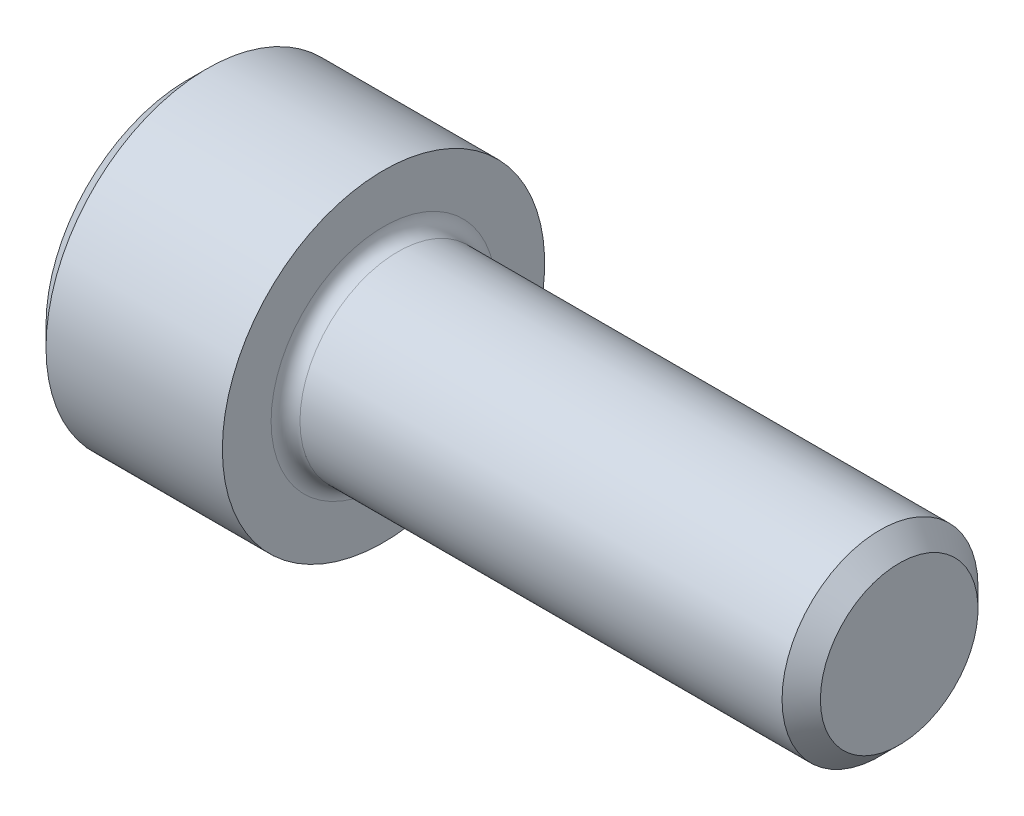
ISO-10303-21;
HEADER;
FILE_DESCRIPTION(('STEP AP214'),'2;1');
FILE_NAME('part.step','',(''),(''),'','','');
FILE_SCHEMA(('AUTOMOTIVE_DESIGN { 1 0 10303 214 1 1 1 1 }'));
ENDSEC;
DATA;
#1=APPLICATION_CONTEXT('core data for automotive mechanical design processes');
#2=APPLICATION_PROTOCOL_DEFINITION('international standard','automotive_design',2000,#1);
#3=PRODUCT_CONTEXT('',#1,'mechanical');
#4=PRODUCT('Part','Part','',(#3));
#5=PRODUCT_RELATED_PRODUCT_CATEGORY('part','',(#4));
#6=PRODUCT_DEFINITION_FORMATION('','',#4);
#7=PRODUCT_DEFINITION_CONTEXT('part definition',#1,'design');
#8=PRODUCT_DEFINITION('design','',#6,#7);
#9=PRODUCT_DEFINITION_SHAPE('','',#8);
#10=(LENGTH_UNIT() NAMED_UNIT(*) SI_UNIT(.MILLI.,.METRE.));
#11=(NAMED_UNIT(*) PLANE_ANGLE_UNIT() SI_UNIT($,.RADIAN.));
#12=(NAMED_UNIT(*) SI_UNIT($,.STERADIAN.) SOLID_ANGLE_UNIT());
#13=UNCERTAINTY_MEASURE_WITH_UNIT(LENGTH_MEASURE(1.E-05),#10,'distance_accuracy_value','');
#14=(GEOMETRIC_REPRESENTATION_CONTEXT(3) GLOBAL_UNCERTAINTY_ASSIGNED_CONTEXT((#13)) GLOBAL_UNIT_ASSIGNED_CONTEXT((#10,
#11,#12)) REPRESENTATION_CONTEXT('',''));
#15=CARTESIAN_POINT('',(0.,0.,0.));
#16=DIRECTION('',(0.,0.,1.));
#17=DIRECTION('',(1.,0.,0.));
#18=AXIS2_PLACEMENT_3D('',#15,#16,#17);
#19=CARTESIAN_POINT('',(0.,0.,0.));
#20=DIRECTION('',(-1.,0.,0.));
#21=DIRECTION('',(0.,0.,1.));
#22=AXIS2_PLACEMENT_3D('',#19,#20,#21);
#23=PLANE('',#22);
#24=DIRECTION('',(0.,-0.499999999999999,0.866025403784439));
#25=VECTOR('',#24,1.);
#26=CARTESIAN_POINT('',(0.,2.2920921156882,0.));
#27=LINE('',#26,#25);
#28=CARTESIAN_POINT('',(0.,2.2920921156882,0.));
#29=VERTEX_POINT('',#28);
#30=CARTESIAN_POINT('',(0.,1.14604605784411,1.98501));
#31=VERTEX_POINT('',#30);
#32=EDGE_CURVE('E388',#29,#31,#27,.T.);
#33=ORIENTED_EDGE('',*,*,#32,.T.);
#34=DIRECTION('',(0.,1.,0.));
#35=VECTOR('',#34,1.);
#36=CARTESIAN_POINT('',(0.,-1.14604605784409,1.98501));
#37=LINE('',#36,#35);
#38=CARTESIAN_POINT('',(0.,-1.14604605784409,1.98501));
#39=VERTEX_POINT('',#38);
#40=EDGE_CURVE('E130',#39,#31,#37,.T.);
#41=ORIENTED_EDGE('',*,*,#40,.F.);
#42=DIRECTION('',(0.,-0.500000000000001,-0.866025403784438));
#43=VECTOR('',#42,1.);
#44=CARTESIAN_POINT('',(0.,-1.14604605784409,1.98501));
#45=LINE('',#44,#43);
#46=CARTESIAN_POINT('',(0.,-2.29209211568819,0.));
#47=VERTEX_POINT('',#46);
#48=EDGE_CURVE('E391',#39,#47,#45,.T.);
#49=ORIENTED_EDGE('',*,*,#48,.T.);
#50=DIRECTION('',(0.,0.499999999999999,-0.866025403784439));
#51=VECTOR('',#50,1.);
#52=CARTESIAN_POINT('',(0.,-2.29209211568819,0.));
#53=LINE('',#52,#51);
#54=CARTESIAN_POINT('',(0.,-1.1460460578441,-1.98501));
#55=VERTEX_POINT('',#54);
#56=EDGE_CURVE('E394',#47,#55,#53,.T.);
#57=ORIENTED_EDGE('',*,*,#56,.T.);
#58=DIRECTION('',(0.,-1.,0.));
#59=VECTOR('',#58,1.);
#60=CARTESIAN_POINT('',(0.,1.1460460578441,-1.98501));
#61=LINE('',#60,#59);
#62=CARTESIAN_POINT('',(0.,1.1460460578441,-1.98501));
#63=VERTEX_POINT('',#62);
#64=EDGE_CURVE('E397',#63,#55,#61,.T.);
#65=ORIENTED_EDGE('',*,*,#64,.F.);
#66=DIRECTION('',(0.,-0.500000000000001,-0.866025403784438));
#67=VECTOR('',#66,1.);
#68=CARTESIAN_POINT('',(0.,2.2920921156882,0.));
#69=LINE('',#68,#67);
#70=EDGE_CURVE('E125',#29,#63,#69,.T.);
#71=ORIENTED_EDGE('',*,*,#70,.F.);
#72=EDGE_LOOP('',(#33,#41,#49,#57,#65,#71));
#73=FACE_BOUND('',#72,.T.);
#74=CARTESIAN_POINT('',(0.,0.,0.));
#75=DIRECTION('',(-1.,0.,0.));
#76=DIRECTION('',(0.,0.,1.));
#77=AXIS2_PLACEMENT_3D('',#74,#75,#76);
#78=CIRCLE('',#77,3.48615);
#79=CARTESIAN_POINT('',(0.,0.,3.48615));
#80=VERTEX_POINT('',#79);
#81=EDGE_CURVE('E141',#80,#80,#78,.T.);
#82=ORIENTED_EDGE('',*,*,#81,.T.);
#83=EDGE_LOOP('',(#82));
#84=FACE_BOUND('',#83,.T.);
#85=ADVANCED_FACE('F34',(#73,#84),#23,.T.);
#86=CARTESIAN_POINT('',(17.526,1.94056,0.));
#87=DIRECTION('',(1.,0.,0.));
#88=DIRECTION('',(0.,0.,-1.));
#89=AXIS2_PLACEMENT_3D('',#86,#87,#88);
#90=PLANE('',#89);
#91=CARTESIAN_POINT('',(17.526,0.,0.));
#92=DIRECTION('',(-1.,0.,0.));
#93=DIRECTION('',(0.,0.,1.));
#94=AXIS2_PLACEMENT_3D('',#91,#92,#93);
#95=CIRCLE('',#94,1.94056);
#96=CARTESIAN_POINT('',(17.526,0.,1.94056));
#97=VERTEX_POINT('',#96);
#98=EDGE_CURVE('E154',#97,#97,#95,.T.);
#99=ORIENTED_EDGE('',*,*,#98,.F.);
#100=EDGE_LOOP('',(#99));
#101=FACE_BOUND('',#100,.T.);
#102=ADVANCED_FACE('F175',(#101),#90,.T.);
#103=CARTESIAN_POINT('',(17.526,0.,0.));
#104=DIRECTION('',(-1.,0.,0.));
#105=DIRECTION('',(0.,0.,1.));
#106=AXIS2_PLACEMENT_3D('',#103,#104,#105);
#107=CONICAL_SURFACE('',#106,1.94056,0.785398163397459);
#108=CARTESIAN_POINT('',(17.05356,0.,0.));
#109=DIRECTION('',(-1.,0.,0.));
#110=DIRECTION('',(0.,0.,1.));
#111=AXIS2_PLACEMENT_3D('',#108,#109,#110);
#112=CIRCLE('',#111,2.413);
#113=CARTESIAN_POINT('',(17.05356,0.,2.413));
#114=VERTEX_POINT('',#113);
#115=EDGE_CURVE('E151',#114,#114,#112,.T.);
#116=ORIENTED_EDGE('',*,*,#115,.F.);
#117=EDGE_LOOP('',(#116));
#118=FACE_BOUND('',#117,.T.);
#119=ORIENTED_EDGE('',*,*,#98,.T.);
#120=EDGE_LOOP('',(#119));
#121=FACE_BOUND('',#120,.T.);
#122=ADVANCED_FACE('F181',(#118,#121),#107,.T.);
#123=CARTESIAN_POINT('',(-31.75,0.,0.));
#124=DIRECTION('',(-1.,0.,0.));
#125=DIRECTION('',(0.,0.,1.));
#126=AXIS2_PLACEMENT_3D('',#123,#124,#125);
#127=CYLINDRICAL_SURFACE('',#126,2.413);
#128=CARTESIAN_POINT('',(5.1816,0.,0.));
#129=DIRECTION('',(1.,0.,0.));
#130=DIRECTION('',(0.,0.,-1.));
#131=AXIS2_PLACEMENT_3D('',#128,#129,#130);
#132=CIRCLE('',#131,2.413);
#133=CARTESIAN_POINT('',(5.1816,0.,-2.413));
#134=VERTEX_POINT('',#133);
#135=EDGE_CURVE('E11',#134,#134,#132,.T.);
#136=ORIENTED_EDGE('',*,*,#135,.T.);
#137=EDGE_LOOP('',(#136));
#138=FACE_BOUND('',#137,.T.);
#139=ORIENTED_EDGE('',*,*,#115,.T.);
#140=EDGE_LOOP('',(#139));
#141=FACE_BOUND('',#140,.T.);
#142=ADVANCED_FACE('F192',(#138,#141),#127,.T.);
#143=CARTESIAN_POINT('',(4.826,3.96875,0.));
#144=DIRECTION('',(1.,0.,0.));
#145=DIRECTION('',(0.,0.,-1.));
#146=AXIS2_PLACEMENT_3D('',#143,#144,#145);
#147=PLANE('',#146);
#148=CARTESIAN_POINT('',(4.826,0.,0.));
#149=DIRECTION('',(1.,0.,0.));
#150=DIRECTION('',(0.,0.,-1.));
#151=AXIS2_PLACEMENT_3D('',#148,#149,#150);
#152=CIRCLE('',#151,2.7686);
#153=CARTESIAN_POINT('',(4.826,0.,-2.7686));
#154=VERTEX_POINT('',#153);
#155=EDGE_CURVE('E42',#154,#154,#152,.F.);
#156=ORIENTED_EDGE('',*,*,#155,.T.);
#157=EDGE_LOOP('',(#156));
#158=FACE_BOUND('',#157,.T.);
#159=CARTESIAN_POINT('',(4.826,0.,0.));
#160=DIRECTION('',(-1.,0.,0.));
#161=DIRECTION('',(0.,0.,1.));
#162=AXIS2_PLACEMENT_3D('',#159,#160,#161);
#163=CIRCLE('',#162,3.96875);
#164=CARTESIAN_POINT('',(4.826,0.,3.96875));
#165=VERTEX_POINT('',#164);
#166=EDGE_CURVE('E148',#165,#165,#163,.T.);
#167=ORIENTED_EDGE('',*,*,#166,.F.);
#168=EDGE_LOOP('',(#167));
#169=FACE_BOUND('',#168,.T.);
#170=ADVANCED_FACE('F159',(#158,#169),#147,.T.);
#171=CARTESIAN_POINT('',(-31.75,0.,0.));
#172=DIRECTION('',(-1.,0.,0.));
#173=DIRECTION('',(0.,0.,1.));
#174=AXIS2_PLACEMENT_3D('',#171,#172,#173);
#175=CYLINDRICAL_SURFACE('',#174,3.96875);
#176=ORIENTED_EDGE('',*,*,#166,.T.);
#177=EDGE_LOOP('',(#176));
#178=FACE_BOUND('',#177,.T.);
#179=CARTESIAN_POINT('',(0.4826,0.,0.));
#180=DIRECTION('',(-1.,0.,0.));
#181=DIRECTION('',(0.,0.,1.));
#182=AXIS2_PLACEMENT_3D('',#179,#180,#181);
#183=CIRCLE('',#182,3.96875);
#184=CARTESIAN_POINT('',(0.4826,0.,3.96875));
#185=VERTEX_POINT('',#184);
#186=EDGE_CURVE('E145',#185,#185,#183,.T.);
#187=ORIENTED_EDGE('',*,*,#186,.F.);
#188=EDGE_LOOP('',(#187));
#189=FACE_BOUND('',#188,.T.);
#190=ADVANCED_FACE('F170',(#178,#189),#175,.T.);
#191=CARTESIAN_POINT('',(0.,0.,0.));
#192=DIRECTION('',(1.,0.,0.));
#193=DIRECTION('',(0.,0.,-1.));
#194=AXIS2_PLACEMENT_3D('',#191,#192,#193);
#195=CONICAL_SURFACE('',#194,3.48615,0.785398163397453);
#196=ORIENTED_EDGE('',*,*,#186,.T.);
#197=EDGE_LOOP('',(#196));
#198=FACE_BOUND('',#197,.T.);
#199=ORIENTED_EDGE('',*,*,#81,.F.);
#200=EDGE_LOOP('',(#199));
#201=FACE_BOUND('',#200,.T.);
#202=ADVANCED_FACE('F163',(#198,#201),#195,.T.);
#203=CARTESIAN_POINT('',(5.1816,0.,0.));
#204=DIRECTION('',(1.,0.,0.));
#205=DIRECTION('',(0.,0.,-1.));
#206=AXIS2_PLACEMENT_3D('',#203,#204,#205);
#207=TOROIDAL_SURFACE('',#206,2.7686,0.3556);
#208=ORIENTED_EDGE('',*,*,#135,.F.);
#209=EDGE_LOOP('',(#208));
#210=FACE_BOUND('',#209,.T.);
#211=ORIENTED_EDGE('',*,*,#155,.F.);
#212=EDGE_LOOP('',(#211));
#213=FACE_BOUND('',#212,.T.);
#214=ADVANCED_FACE('F36',(#210,#213),#207,.F.);
#215=CARTESIAN_POINT('',(2.286,2.2920921156882,0.));
#216=DIRECTION('',(0.,-0.866025403784439,-0.499999999999999));
#217=DIRECTION('',(0.,0.499999999999999,-0.866025403784439));
#218=AXIS2_PLACEMENT_3D('',#215,#216,#217);
#219=PLANE('',#218);
#220=ORIENTED_EDGE('',*,*,#32,.F.);
#221=DIRECTION('',(-1.,0.,0.));
#222=VECTOR('',#221,1.);
#223=CARTESIAN_POINT('',(2.286,2.2920921156882,0.));
#224=LINE('',#223,#222);
#225=CARTESIAN_POINT('',(2.286,2.2920921156882,0.));
#226=VERTEX_POINT('',#225);
#227=EDGE_CURVE('E378',#226,#29,#224,.T.);
#228=ORIENTED_EDGE('',*,*,#227,.F.);
#229=DIRECTION('',(0.,-0.499999999999999,0.866025403784439));
#230=VECTOR('',#229,1.);
#231=CARTESIAN_POINT('',(2.286,2.2920921156882,0.));
#232=LINE('',#231,#230);
#233=CARTESIAN_POINT('',(2.286,1.71906908676615,0.992505));
#234=VERTEX_POINT('',#233);
#235=EDGE_CURVE('E117',#226,#234,#232,.T.);
#236=ORIENTED_EDGE('',*,*,#235,.T.);
#237=CARTESIAN_POINT('',(2.286,1.14604605784411,1.98501));
#238=VERTEX_POINT('',#237);
#239=EDGE_CURVE('E108',#234,#238,#232,.T.);
#240=ORIENTED_EDGE('',*,*,#239,.T.);
#241=DIRECTION('',(-1.,0.,0.));
#242=VECTOR('',#241,1.);
#243=CARTESIAN_POINT('',(2.286,1.14604605784411,1.98501));
#244=LINE('',#243,#242);
#245=EDGE_CURVE('E122',#238,#31,#244,.T.);
#246=ORIENTED_EDGE('',*,*,#245,.T.);
#247=EDGE_LOOP('',(#220,#228,#236,#240,#246));
#248=FACE_BOUND('',#247,.T.);
#249=ADVANCED_FACE('F121',(#248),#219,.T.);
#250=CARTESIAN_POINT('',(2.286,-1.14604605784409,1.98501));
#251=DIRECTION('',(0.,0.,1.));
#252=DIRECTION('',(0.,-1.,0.));
#253=AXIS2_PLACEMENT_3D('',#250,#251,#252);
#254=PLANE('',#253);
#255=ORIENTED_EDGE('',*,*,#40,.T.);
#256=ORIENTED_EDGE('',*,*,#245,.F.);
#257=DIRECTION('',(0.,1.,0.));
#258=VECTOR('',#257,1.);
#259=CARTESIAN_POINT('',(2.286,-1.14604605784409,1.98501));
#260=LINE('',#259,#258);
#261=CARTESIAN_POINT('',(2.286,0.,1.98501));
#262=VERTEX_POINT('',#261);
#263=EDGE_CURVE('E105',#262,#238,#260,.T.);
#264=ORIENTED_EDGE('',*,*,#263,.F.);
#265=CARTESIAN_POINT('',(2.286,-1.14604605784409,1.98501));
#266=VERTEX_POINT('',#265);
#267=EDGE_CURVE('E116',#266,#262,#260,.T.);
#268=ORIENTED_EDGE('',*,*,#267,.F.);
#269=DIRECTION('',(-1.,0.,0.));
#270=VECTOR('',#269,1.);
#271=CARTESIAN_POINT('',(2.286,-1.14604605784409,1.98501));
#272=LINE('',#271,#270);
#273=EDGE_CURVE('E132',#266,#39,#272,.T.);
#274=ORIENTED_EDGE('',*,*,#273,.T.);
#275=EDGE_LOOP('',(#255,#256,#264,#268,#274));
#276=FACE_BOUND('',#275,.T.);
#277=ADVANCED_FACE('F127',(#276),#254,.F.);
#278=CARTESIAN_POINT('',(2.286,-1.14604605784409,1.98501));
#279=DIRECTION('',(0.,0.866025403784438,-0.500000000000001));
#280=DIRECTION('',(0.,0.500000000000001,0.866025403784438));
#281=AXIS2_PLACEMENT_3D('',#278,#279,#280);
#282=PLANE('',#281);
#283=ORIENTED_EDGE('',*,*,#48,.F.);
#284=ORIENTED_EDGE('',*,*,#273,.F.);
#285=DIRECTION('',(0.,-0.500000000000001,-0.866025403784438));
#286=VECTOR('',#285,1.);
#287=CARTESIAN_POINT('',(2.286,-1.14604605784409,1.98501));
#288=LINE('',#287,#286);
#289=CARTESIAN_POINT('',(2.286,-1.71906908676614,0.992505));
#290=VERTEX_POINT('',#289);
#291=EDGE_CURVE('E417',#266,#290,#288,.T.);
#292=ORIENTED_EDGE('',*,*,#291,.T.);
#293=CARTESIAN_POINT('',(2.286,-2.29209211568819,0.));
#294=VERTEX_POINT('',#293);
#295=EDGE_CURVE('E406',#290,#294,#288,.T.);
#296=ORIENTED_EDGE('',*,*,#295,.T.);
#297=DIRECTION('',(-1.,0.,0.));
#298=VECTOR('',#297,1.);
#299=CARTESIAN_POINT('',(2.286,-2.29209211568819,0.));
#300=LINE('',#299,#298);
#301=EDGE_CURVE('E137',#294,#47,#300,.T.);
#302=ORIENTED_EDGE('',*,*,#301,.T.);
#303=EDGE_LOOP('',(#283,#284,#292,#296,#302));
#304=FACE_BOUND('',#303,.T.);
#305=ADVANCED_FACE('F269',(#304),#282,.T.);
#306=CARTESIAN_POINT('',(2.286,-2.29209211568819,0.));
#307=DIRECTION('',(0.,0.866025403784439,0.499999999999999));
#308=DIRECTION('',(0.,-0.499999999999999,0.866025403784439));
#309=AXIS2_PLACEMENT_3D('',#306,#307,#308);
#310=PLANE('',#309);
#311=ORIENTED_EDGE('',*,*,#56,.F.);
#312=ORIENTED_EDGE('',*,*,#301,.F.);
#313=DIRECTION('',(0.,0.499999999999999,-0.866025403784439));
#314=VECTOR('',#313,1.);
#315=CARTESIAN_POINT('',(2.286,-2.29209211568819,0.));
#316=LINE('',#315,#314);
#317=CARTESIAN_POINT('',(2.286,-1.71906908676615,-0.992504999999996));
#318=VERTEX_POINT('',#317);
#319=EDGE_CURVE('E384',#294,#318,#316,.T.);
#320=ORIENTED_EDGE('',*,*,#319,.T.);
#321=CARTESIAN_POINT('',(2.286,-1.1460460578441,-1.98501));
#322=VERTEX_POINT('',#321);
#323=EDGE_CURVE('E416',#318,#322,#316,.T.);
#324=ORIENTED_EDGE('',*,*,#323,.T.);
#325=DIRECTION('',(-1.,0.,0.));
#326=VECTOR('',#325,1.);
#327=CARTESIAN_POINT('',(2.286,-1.1460460578441,-1.98501));
#328=LINE('',#327,#326);
#329=EDGE_CURVE('E377',#322,#55,#328,.T.);
#330=ORIENTED_EDGE('',*,*,#329,.T.);
#331=EDGE_LOOP('',(#311,#312,#320,#324,#330));
#332=FACE_BOUND('',#331,.T.);
#333=ADVANCED_FACE('F277',(#332),#310,.T.);
#334=CARTESIAN_POINT('',(2.286,1.1460460578441,-1.98501));
#335=DIRECTION('',(0.,0.,-1.));
#336=DIRECTION('',(0.,1.,0.));
#337=AXIS2_PLACEMENT_3D('',#334,#335,#336);
#338=PLANE('',#337);
#339=ORIENTED_EDGE('',*,*,#64,.T.);
#340=ORIENTED_EDGE('',*,*,#329,.F.);
#341=DIRECTION('',(0.,-1.,0.));
#342=VECTOR('',#341,1.);
#343=CARTESIAN_POINT('',(2.286,1.1460460578441,-1.98501));
#344=LINE('',#343,#342);
#345=CARTESIAN_POINT('',(2.286,0.,-1.98501));
#346=VERTEX_POINT('',#345);
#347=EDGE_CURVE('E381',#346,#322,#344,.T.);
#348=ORIENTED_EDGE('',*,*,#347,.F.);
#349=CARTESIAN_POINT('',(2.286,1.1460460578441,-1.98501));
#350=VERTEX_POINT('',#349);
#351=EDGE_CURVE('E49',#350,#346,#344,.T.);
#352=ORIENTED_EDGE('',*,*,#351,.F.);
#353=DIRECTION('',(-1.,0.,0.));
#354=VECTOR('',#353,1.);
#355=CARTESIAN_POINT('',(2.286,1.1460460578441,-1.98501));
#356=LINE('',#355,#354);
#357=EDGE_CURVE('E374',#350,#63,#356,.T.);
#358=ORIENTED_EDGE('',*,*,#357,.T.);
#359=EDGE_LOOP('',(#339,#340,#348,#352,#358));
#360=FACE_BOUND('',#359,.T.);
#361=ADVANCED_FACE('F286',(#360),#338,.F.);
#362=CARTESIAN_POINT('',(2.286,2.2920921156882,0.));
#363=DIRECTION('',(0.,0.866025403784438,-0.500000000000001));
#364=DIRECTION('',(0.,0.500000000000001,0.866025403784438));
#365=AXIS2_PLACEMENT_3D('',#362,#363,#364);
#366=PLANE('',#365);
#367=ORIENTED_EDGE('',*,*,#70,.T.);
#368=ORIENTED_EDGE('',*,*,#357,.F.);
#369=DIRECTION('',(0.,-0.500000000000001,-0.866025403784438));
#370=VECTOR('',#369,1.);
#371=CARTESIAN_POINT('',(2.286,2.2920921156882,0.));
#372=LINE('',#371,#370);
#373=CARTESIAN_POINT('',(2.286,1.71906908676615,-0.992505000000005));
#374=VERTEX_POINT('',#373);
#375=EDGE_CURVE('E364',#374,#350,#372,.T.);
#376=ORIENTED_EDGE('',*,*,#375,.F.);
#377=EDGE_CURVE('E370',#226,#374,#372,.T.);
#378=ORIENTED_EDGE('',*,*,#377,.F.);
#379=ORIENTED_EDGE('',*,*,#227,.T.);
#380=EDGE_LOOP('',(#367,#368,#376,#378,#379));
#381=FACE_BOUND('',#380,.T.);
#382=ADVANCED_FACE('F295',(#381),#366,.F.);
#383=CARTESIAN_POINT('',(2.286,2.2920921156882,0.));
#384=DIRECTION('',(1.,0.,0.));
#385=DIRECTION('',(0.,0.,-1.));
#386=AXIS2_PLACEMENT_3D('',#383,#384,#385);
#387=PLANE('',#386);
#388=ORIENTED_EDGE('',*,*,#347,.T.);
#389=ORIENTED_EDGE('',*,*,#323,.F.);
#390=CARTESIAN_POINT('',(2.286,0.,0.));
#391=DIRECTION('',(-1.,0.,0.));
#392=DIRECTION('',(0.,0.,1.));
#393=AXIS2_PLACEMENT_3D('',#390,#391,#392);
#394=CIRCLE('',#393,1.98501);
#395=EDGE_CURVE('E412',#346,#318,#394,.T.);
#396=ORIENTED_EDGE('',*,*,#395,.F.);
#397=EDGE_LOOP('',(#388,#389,#396));
#398=FACE_BOUND('',#397,.T.);
#399=ADVANCED_FACE('F304',(#398),#387,.F.);
#400=ORIENTED_EDGE('',*,*,#319,.F.);
#401=ORIENTED_EDGE('',*,*,#295,.F.);
#402=EDGE_CURVE('E135',#318,#290,#394,.T.);
#403=ORIENTED_EDGE('',*,*,#402,.F.);
#404=EDGE_LOOP('',(#400,#401,#403));
#405=FACE_BOUND('',#404,.T.);
#406=ADVANCED_FACE('F313',(#405),#387,.F.);
#407=ORIENTED_EDGE('',*,*,#291,.F.);
#408=ORIENTED_EDGE('',*,*,#267,.T.);
#409=EDGE_CURVE('E131',#290,#262,#394,.T.);
#410=ORIENTED_EDGE('',*,*,#409,.F.);
#411=EDGE_LOOP('',(#407,#408,#410));
#412=FACE_BOUND('',#411,.T.);
#413=ADVANCED_FACE('F322',(#412),#387,.F.);
#414=ORIENTED_EDGE('',*,*,#263,.T.);
#415=ORIENTED_EDGE('',*,*,#239,.F.);
#416=EDGE_CURVE('E111',#262,#234,#394,.T.);
#417=ORIENTED_EDGE('',*,*,#416,.F.);
#418=EDGE_LOOP('',(#414,#415,#417));
#419=FACE_BOUND('',#418,.T.);
#420=ADVANCED_FACE('F107',(#419),#387,.F.);
#421=ORIENTED_EDGE('',*,*,#235,.F.);
#422=ORIENTED_EDGE('',*,*,#377,.T.);
#423=EDGE_CURVE('E142',#234,#374,#394,.T.);
#424=ORIENTED_EDGE('',*,*,#423,.F.);
#425=EDGE_LOOP('',(#421,#422,#424));
#426=FACE_BOUND('',#425,.T.);
#427=ADVANCED_FACE('F337',(#426),#387,.F.);
#428=ORIENTED_EDGE('',*,*,#375,.T.);
#429=ORIENTED_EDGE('',*,*,#351,.T.);
#430=EDGE_CURVE('E367',#374,#346,#394,.T.);
#431=ORIENTED_EDGE('',*,*,#430,.F.);
#432=EDGE_LOOP('',(#428,#429,#431));
#433=FACE_BOUND('',#432,.T.);
#434=ADVANCED_FACE('F252',(#433),#387,.F.);
#435=CARTESIAN_POINT('',(2.286,0.,0.));
#436=DIRECTION('',(-1.,0.,0.));
#437=DIRECTION('',(0.,0.,1.));
#438=AXIS2_PLACEMENT_3D('',#435,#436,#437);
#439=CONICAL_SURFACE('',#438,1.98501,1.04719755119659);
#440=CARTESIAN_POINT('',(3.43204605784411,0.,0.));
#441=VERTEX_POINT('',#440);
#442=VERTEX_LOOP('',#441);
#443=FACE_BOUND('',#442,.T.);
#444=ORIENTED_EDGE('',*,*,#416,.T.);
#445=ORIENTED_EDGE('',*,*,#423,.T.);
#446=ORIENTED_EDGE('',*,*,#430,.T.);
#447=ORIENTED_EDGE('',*,*,#395,.T.);
#448=ORIENTED_EDGE('',*,*,#402,.T.);
#449=ORIENTED_EDGE('',*,*,#409,.T.);
#450=EDGE_LOOP('',(#444,#445,#446,#447,#448,#449));
#451=FACE_BOUND('',#450,.T.);
#452=ADVANCED_FACE('F185',(#443,#451),#439,.F.);
#453=CLOSED_SHELL('',(#85,#102,#122,#142,#170,#190,#202,#214,#249,#277,#305,#333,#361,#382,#399,
#406,#413,#420,#427,#434,#452));
#454=MANIFOLD_SOLID_BREP('B2',#453);
#455=ADVANCED_BREP_SHAPE_REPRESENTATION('',(#18,#454),#14);
#456=SHAPE_DEFINITION_REPRESENTATION(#9,#455);
ENDSEC;
END-ISO-10303-21;
